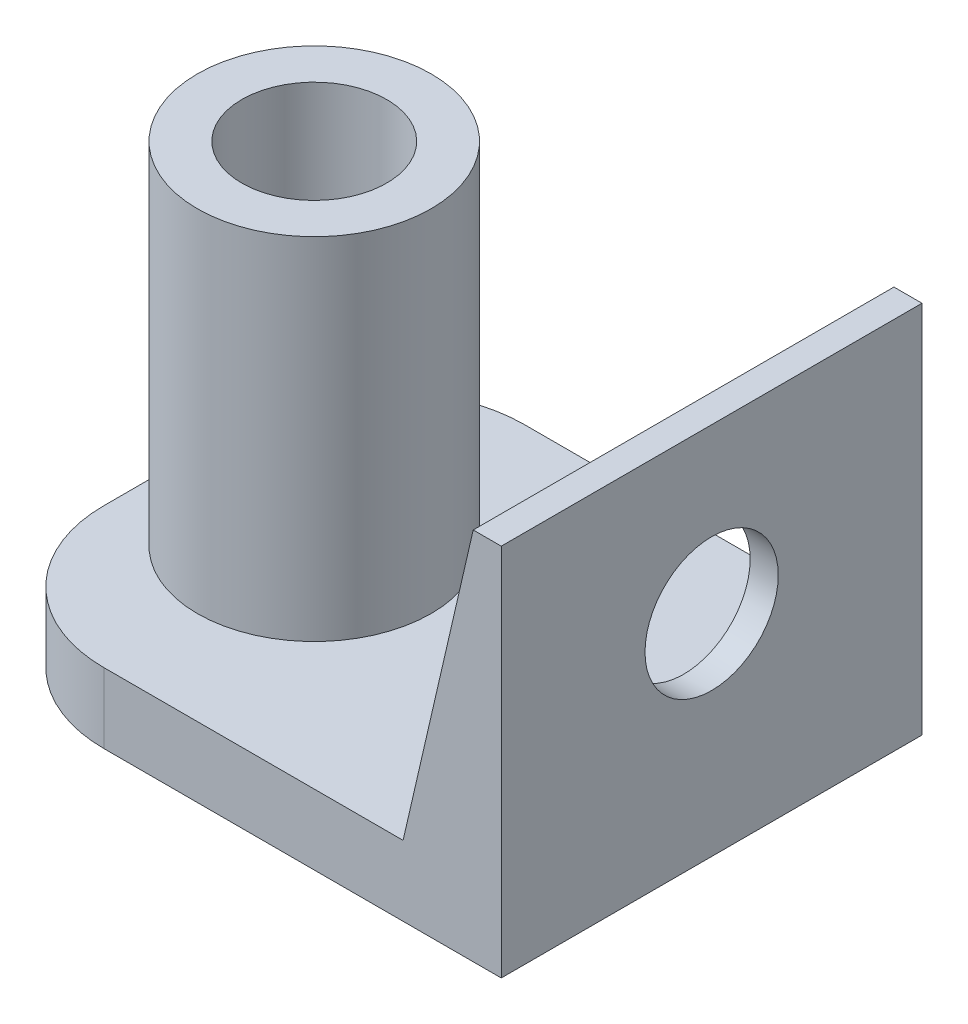
ISO-10303-21;
HEADER;
FILE_DESCRIPTION(('STEP AP214'),'2;1');
FILE_NAME('part.step','',(''),(''),'','','');
FILE_SCHEMA(('AUTOMOTIVE_DESIGN { 1 0 10303 214 1 1 1 1 }'));
ENDSEC;
DATA;
#1=APPLICATION_CONTEXT('core data for automotive mechanical design processes');
#2=APPLICATION_PROTOCOL_DEFINITION('international standard','automotive_design',2000,#1);
#3=PRODUCT_CONTEXT('',#1,'mechanical');
#4=PRODUCT('Part','Part','',(#3));
#5=PRODUCT_RELATED_PRODUCT_CATEGORY('part','',(#4));
#6=PRODUCT_DEFINITION_FORMATION('','',#4);
#7=PRODUCT_DEFINITION_CONTEXT('part definition',#1,'design');
#8=PRODUCT_DEFINITION('design','',#6,#7);
#9=PRODUCT_DEFINITION_SHAPE('','',#8);
#10=(LENGTH_UNIT() NAMED_UNIT(*) SI_UNIT(.MILLI.,.METRE.));
#11=(NAMED_UNIT(*) PLANE_ANGLE_UNIT() SI_UNIT($,.RADIAN.));
#12=(NAMED_UNIT(*) SI_UNIT($,.STERADIAN.) SOLID_ANGLE_UNIT());
#13=UNCERTAINTY_MEASURE_WITH_UNIT(LENGTH_MEASURE(1.E-05),#10,'distance_accuracy_value','');
#14=(GEOMETRIC_REPRESENTATION_CONTEXT(3) GLOBAL_UNCERTAINTY_ASSIGNED_CONTEXT((#13)) GLOBAL_UNIT_ASSIGNED_CONTEXT((#10,
#11,#12)) REPRESENTATION_CONTEXT('',''));
#15=CARTESIAN_POINT('',(0.,0.,0.));
#16=DIRECTION('',(0.,0.,1.));
#17=DIRECTION('',(1.,0.,0.));
#18=AXIS2_PLACEMENT_3D('',#15,#16,#17);
#19=CARTESIAN_POINT('',(21.8,3.,18.));
#20=DIRECTION('',(0.,-1.,0.));
#21=DIRECTION('',(1.,0.,0.));
#22=AXIS2_PLACEMENT_3D('',#19,#20,#21);
#23=PLANE('',#22);
#24=CARTESIAN_POINT('',(6.,3.,9.));
#25=DIRECTION('',(0.,-1.,0.));
#26=DIRECTION('',(1.,0.,0.));
#27=AXIS2_PLACEMENT_3D('',#24,#25,#26);
#28=CIRCLE('',#27,5.);
#29=CARTESIAN_POINT('',(11.,3.,9.));
#30=VERTEX_POINT('',#29);
#31=EDGE_CURVE('E41',#30,#30,#28,.F.);
#32=ORIENTED_EDGE('',*,*,#31,.F.);
#33=EDGE_LOOP('',(#32));
#34=FACE_BOUND('',#33,.T.);
#35=DIRECTION('',(-1.,0.,0.));
#36=VECTOR('',#35,1.);
#37=CARTESIAN_POINT('',(21.8,3.,0.));
#38=LINE('',#37,#36);
#39=CARTESIAN_POINT('',(18.8,3.,0.));
#40=VERTEX_POINT('',#39);
#41=CARTESIAN_POINT('',(6.,3.,0.));
#42=VERTEX_POINT('',#41);
#43=EDGE_CURVE('E227',#40,#42,#38,.T.);
#44=ORIENTED_EDGE('',*,*,#43,.T.);
#45=CARTESIAN_POINT('',(6.,3.,6.));
#46=DIRECTION('',(0.,-1.,0.));
#47=DIRECTION('',(1.,0.,0.));
#48=AXIS2_PLACEMENT_3D('',#45,#46,#47);
#49=CIRCLE('',#48,6.);
#50=CARTESIAN_POINT('',(0.,3.,6.));
#51=VERTEX_POINT('',#50);
#52=EDGE_CURVE('E176',#42,#51,#49,.F.);
#53=ORIENTED_EDGE('',*,*,#52,.T.);
#54=DIRECTION('',(0.,0.,-1.));
#55=VECTOR('',#54,1.);
#56=CARTESIAN_POINT('',(0.,3.,18.));
#57=LINE('',#56,#55);
#58=CARTESIAN_POINT('',(0.,3.,12.));
#59=VERTEX_POINT('',#58);
#60=EDGE_CURVE('E142',#59,#51,#57,.T.);
#61=ORIENTED_EDGE('',*,*,#60,.F.);
#62=CARTESIAN_POINT('',(6.,3.,12.));
#63=DIRECTION('',(0.,-1.,0.));
#64=DIRECTION('',(1.,0.,0.));
#65=AXIS2_PLACEMENT_3D('',#62,#63,#64);
#66=CIRCLE('',#65,6.);
#67=CARTESIAN_POINT('',(6.,3.,18.));
#68=VERTEX_POINT('',#67);
#69=EDGE_CURVE('E48',#59,#68,#66,.F.);
#70=ORIENTED_EDGE('',*,*,#69,.T.);
#71=DIRECTION('',(-1.,0.,0.));
#72=VECTOR('',#71,1.);
#73=CARTESIAN_POINT('',(21.8,3.,18.));
#74=LINE('',#73,#72);
#75=CARTESIAN_POINT('',(18.8,3.,18.));
#76=VERTEX_POINT('',#75);
#77=EDGE_CURVE('E147',#76,#68,#74,.T.);
#78=ORIENTED_EDGE('',*,*,#77,.F.);
#79=DIRECTION('',(0.,0.,1.));
#80=VECTOR('',#79,1.);
#81=CARTESIAN_POINT('',(18.8,3.,15.));
#82=LINE('',#81,#80);
#83=CARTESIAN_POINT('',(18.8,3.,15.));
#84=VERTEX_POINT('',#83);
#85=EDGE_CURVE('E135',#84,#76,#82,.T.);
#86=ORIENTED_EDGE('',*,*,#85,.F.);
#87=DIRECTION('',(1.,0.,0.));
#88=VECTOR('',#87,1.);
#89=CARTESIAN_POINT('',(18.8,3.,15.));
#90=LINE('',#89,#88);
#91=CARTESIAN_POINT('',(21.8,3.,15.));
#92=VERTEX_POINT('',#91);
#93=EDGE_CURVE('E123',#84,#92,#90,.T.);
#94=ORIENTED_EDGE('',*,*,#93,.T.);
#95=DIRECTION('',(0.,0.,-1.));
#96=VECTOR('',#95,1.);
#97=CARTESIAN_POINT('',(21.8,3.,18.));
#98=LINE('',#97,#96);
#99=CARTESIAN_POINT('',(21.8,3.,3.));
#100=VERTEX_POINT('',#99);
#101=EDGE_CURVE('E133',#92,#100,#98,.T.);
#102=ORIENTED_EDGE('',*,*,#101,.T.);
#103=DIRECTION('',(1.,0.,0.));
#104=VECTOR('',#103,1.);
#105=CARTESIAN_POINT('',(18.8,3.,3.));
#106=LINE('',#105,#104);
#107=CARTESIAN_POINT('',(18.8,3.,3.));
#108=VERTEX_POINT('',#107);
#109=EDGE_CURVE('E269',#108,#100,#106,.T.);
#110=ORIENTED_EDGE('',*,*,#109,.F.);
#111=DIRECTION('',(0.,0.,-1.));
#112=VECTOR('',#111,1.);
#113=CARTESIAN_POINT('',(18.8,3.,3.));
#114=LINE('',#113,#112);
#115=EDGE_CURVE('E267',#108,#40,#114,.T.);
#116=ORIENTED_EDGE('',*,*,#115,.T.);
#117=EDGE_LOOP('',(#44,#53,#61,#70,#78,#86,#94,#102,#110,#116));
#118=FACE_BOUND('',#117,.T.);
#119=ADVANCED_FACE('F33',(#34,#118),#23,.F.);
#120=CARTESIAN_POINT('',(21.8,16.,18.));
#121=DIRECTION('',(1.,0.,0.));
#122=DIRECTION('',(0.,0.,-1.));
#123=AXIS2_PLACEMENT_3D('',#120,#121,#122);
#124=PLANE('',#123);
#125=CARTESIAN_POINT('',(21.8,9.,9.));
#126=DIRECTION('',(1.,0.,0.));
#127=DIRECTION('',(0.,0.,-1.));
#128=AXIS2_PLACEMENT_3D('',#125,#126,#127);
#129=CIRCLE('',#128,2.85);
#130=CARTESIAN_POINT('',(21.8,9.,6.15));
#131=VERTEX_POINT('',#130);
#132=EDGE_CURVE('E161',#131,#131,#129,.T.);
#133=ORIENTED_EDGE('',*,*,#132,.T.);
#134=EDGE_LOOP('',(#133));
#135=FACE_BOUND('',#134,.T.);
#136=DIRECTION('',(0.,0.,-1.));
#137=VECTOR('',#136,1.);
#138=CARTESIAN_POINT('',(21.8,16.,18.));
#139=LINE('',#138,#137);
#140=CARTESIAN_POINT('',(21.8,16.,15.));
#141=VERTEX_POINT('',#140);
#142=CARTESIAN_POINT('',(21.8,16.,3.));
#143=VERTEX_POINT('',#142);
#144=EDGE_CURVE('E141',#141,#143,#139,.T.);
#145=ORIENTED_EDGE('',*,*,#144,.T.);
#146=DIRECTION('',(0.,1.,0.));
#147=VECTOR('',#146,1.);
#148=CARTESIAN_POINT('',(21.8,3.,3.));
#149=LINE('',#148,#147);
#150=EDGE_CURVE('E140',#100,#143,#149,.T.);
#151=ORIENTED_EDGE('',*,*,#150,.F.);
#152=ORIENTED_EDGE('',*,*,#101,.F.);
#153=DIRECTION('',(0.,1.,0.));
#154=VECTOR('',#153,1.);
#155=CARTESIAN_POINT('',(21.8,3.,15.));
#156=LINE('',#155,#154);
#157=EDGE_CURVE('E120',#92,#141,#156,.T.);
#158=ORIENTED_EDGE('',*,*,#157,.T.);
#159=EDGE_LOOP('',(#145,#151,#152,#158));
#160=FACE_BOUND('',#159,.T.);
#161=ADVANCED_FACE('F138',(#135,#160),#124,.F.);
#162=CARTESIAN_POINT('',(0.,3.,18.));
#163=DIRECTION('',(1.,0.,0.));
#164=DIRECTION('',(0.,1.,0.));
#165=AXIS2_PLACEMENT_3D('',#162,#163,#164);
#166=PLANE('',#165);
#167=ORIENTED_EDGE('',*,*,#60,.T.);
#168=DIRECTION('',(0.,-1.,0.));
#169=VECTOR('',#168,1.);
#170=CARTESIAN_POINT('',(0.,3.,6.));
#171=LINE('',#170,#169);
#172=CARTESIAN_POINT('',(0.,0.,6.));
#173=VERTEX_POINT('',#172);
#174=EDGE_CURVE('E167',#51,#173,#171,.T.);
#175=ORIENTED_EDGE('',*,*,#174,.T.);
#176=DIRECTION('',(0.,0.,-1.));
#177=VECTOR('',#176,1.);
#178=CARTESIAN_POINT('',(0.,0.,18.));
#179=LINE('',#178,#177);
#180=CARTESIAN_POINT('',(0.,0.,12.));
#181=VERTEX_POINT('',#180);
#182=EDGE_CURVE('E157',#181,#173,#179,.T.);
#183=ORIENTED_EDGE('',*,*,#182,.F.);
#184=DIRECTION('',(0.,-1.,0.));
#185=VECTOR('',#184,1.);
#186=CARTESIAN_POINT('',(0.,3.,12.));
#187=LINE('',#186,#185);
#188=EDGE_CURVE('E160',#181,#59,#187,.F.);
#189=ORIENTED_EDGE('',*,*,#188,.T.);
#190=EDGE_LOOP('',(#167,#175,#183,#189));
#191=FACE_BOUND('',#190,.T.);
#192=ADVANCED_FACE('F190',(#191),#166,.F.);
#193=CARTESIAN_POINT('',(0.,0.,18.));
#194=DIRECTION('',(0.,1.,0.));
#195=DIRECTION('',(0.,0.,1.));
#196=AXIS2_PLACEMENT_3D('',#193,#194,#195);
#197=PLANE('',#196);
#198=CARTESIAN_POINT('',(6.,0.,9.));
#199=DIRECTION('',(0.,1.,0.));
#200=DIRECTION('',(0.,0.,1.));
#201=AXIS2_PLACEMENT_3D('',#198,#199,#200);
#202=CIRCLE('',#201,2.7);
#203=CARTESIAN_POINT('',(6.,0.,11.7));
#204=VERTEX_POINT('',#203);
#205=EDGE_CURVE('E165',#204,#204,#202,.T.);
#206=ORIENTED_EDGE('',*,*,#205,.T.);
#207=EDGE_LOOP('',(#206));
#208=FACE_BOUND('',#207,.T.);
#209=ORIENTED_EDGE('',*,*,#182,.T.);
#210=CARTESIAN_POINT('',(6.,0.,6.));
#211=DIRECTION('',(0.,1.,0.));
#212=DIRECTION('',(0.,0.,1.));
#213=AXIS2_PLACEMENT_3D('',#210,#211,#212);
#214=CIRCLE('',#213,6.);
#215=CARTESIAN_POINT('',(6.,0.,0.));
#216=VERTEX_POINT('',#215);
#217=EDGE_CURVE('E172',#173,#216,#214,.F.);
#218=ORIENTED_EDGE('',*,*,#217,.T.);
#219=DIRECTION('',(1.,0.,0.));
#220=VECTOR('',#219,1.);
#221=CARTESIAN_POINT('',(0.,0.,0.));
#222=LINE('',#221,#220);
#223=CARTESIAN_POINT('',(23.,0.,0.));
#224=VERTEX_POINT('',#223);
#225=EDGE_CURVE('E249',#216,#224,#222,.T.);
#226=ORIENTED_EDGE('',*,*,#225,.T.);
#227=DIRECTION('',(0.,0.,-1.));
#228=VECTOR('',#227,1.);
#229=CARTESIAN_POINT('',(23.,0.,18.));
#230=LINE('',#229,#228);
#231=CARTESIAN_POINT('',(23.,0.,18.));
#232=VERTEX_POINT('',#231);
#233=EDGE_CURVE('E154',#232,#224,#230,.T.);
#234=ORIENTED_EDGE('',*,*,#233,.F.);
#235=DIRECTION('',(1.,0.,0.));
#236=VECTOR('',#235,1.);
#237=CARTESIAN_POINT('',(0.,0.,18.));
#238=LINE('',#237,#236);
#239=CARTESIAN_POINT('',(6.,0.,18.));
#240=VERTEX_POINT('',#239);
#241=EDGE_CURVE('E233',#240,#232,#238,.T.);
#242=ORIENTED_EDGE('',*,*,#241,.F.);
#243=CARTESIAN_POINT('',(6.,0.,12.));
#244=DIRECTION('',(0.,1.,0.));
#245=DIRECTION('',(0.,0.,1.));
#246=AXIS2_PLACEMENT_3D('',#243,#244,#245);
#247=CIRCLE('',#246,6.);
#248=EDGE_CURVE('E170',#240,#181,#247,.F.);
#249=ORIENTED_EDGE('',*,*,#248,.T.);
#250=EDGE_LOOP('',(#209,#218,#226,#234,#242,#249));
#251=FACE_BOUND('',#250,.T.);
#252=ADVANCED_FACE('F205',(#208,#251),#197,.F.);
#253=CARTESIAN_POINT('',(23.,0.,18.));
#254=DIRECTION('',(-1.,0.,0.));
#255=DIRECTION('',(0.,0.,1.));
#256=AXIS2_PLACEMENT_3D('',#253,#254,#255);
#257=PLANE('',#256);
#258=CARTESIAN_POINT('',(23.,9.,9.));
#259=DIRECTION('',(-1.,0.,0.));
#260=DIRECTION('',(0.,0.,1.));
#261=AXIS2_PLACEMENT_3D('',#258,#259,#260);
#262=CIRCLE('',#261,2.85);
#263=CARTESIAN_POINT('',(23.,9.,11.85));
#264=VERTEX_POINT('',#263);
#265=EDGE_CURVE('E164',#264,#264,#262,.T.);
#266=ORIENTED_EDGE('',*,*,#265,.T.);
#267=EDGE_LOOP('',(#266));
#268=FACE_BOUND('',#267,.T.);
#269=DIRECTION('',(0.,1.,0.));
#270=VECTOR('',#269,1.);
#271=CARTESIAN_POINT('',(23.,0.,0.));
#272=LINE('',#271,#270);
#273=CARTESIAN_POINT('',(23.,16.,0.));
#274=VERTEX_POINT('',#273);
#275=EDGE_CURVE('E251',#224,#274,#272,.T.);
#276=ORIENTED_EDGE('',*,*,#275,.T.);
#277=DIRECTION('',(0.,0.,-1.));
#278=VECTOR('',#277,1.);
#279=CARTESIAN_POINT('',(23.,16.,18.));
#280=LINE('',#279,#278);
#281=CARTESIAN_POINT('',(23.,16.,18.));
#282=VERTEX_POINT('',#281);
#283=EDGE_CURVE('E151',#282,#274,#280,.T.);
#284=ORIENTED_EDGE('',*,*,#283,.F.);
#285=DIRECTION('',(0.,1.,0.));
#286=VECTOR('',#285,1.);
#287=CARTESIAN_POINT('',(23.,0.,18.));
#288=LINE('',#287,#286);
#289=EDGE_CURVE('E238',#232,#282,#288,.T.);
#290=ORIENTED_EDGE('',*,*,#289,.F.);
#291=ORIENTED_EDGE('',*,*,#233,.T.);
#292=EDGE_LOOP('',(#276,#284,#290,#291));
#293=FACE_BOUND('',#292,.T.);
#294=ADVANCED_FACE('F201',(#268,#293),#257,.F.);
#295=CARTESIAN_POINT('',(23.,16.,18.));
#296=DIRECTION('',(0.,-1.,0.));
#297=DIRECTION('',(0.,0.,-1.));
#298=AXIS2_PLACEMENT_3D('',#295,#296,#297);
#299=PLANE('',#298);
#300=DIRECTION('',(-1.,0.,0.));
#301=VECTOR('',#300,1.);
#302=CARTESIAN_POINT('',(23.,16.,0.));
#303=LINE('',#302,#301);
#304=CARTESIAN_POINT('',(21.8,16.,0.));
#305=VERTEX_POINT('',#304);
#306=EDGE_CURVE('E242',#274,#305,#303,.T.);
#307=ORIENTED_EDGE('',*,*,#306,.T.);
#308=DIRECTION('',(0.,0.,-1.));
#309=VECTOR('',#308,1.);
#310=CARTESIAN_POINT('',(21.8,16.,3.));
#311=LINE('',#310,#309);
#312=EDGE_CURVE('E255',#143,#305,#311,.T.);
#313=ORIENTED_EDGE('',*,*,#312,.F.);
#314=ORIENTED_EDGE('',*,*,#144,.F.);
#315=CARTESIAN_POINT('',(21.8,16.,18.));
#316=VERTEX_POINT('',#315);
#317=EDGE_CURVE('E144',#316,#141,#139,.T.);
#318=ORIENTED_EDGE('',*,*,#317,.F.);
#319=DIRECTION('',(-1.,0.,0.));
#320=VECTOR('',#319,1.);
#321=CARTESIAN_POINT('',(23.,16.,18.));
#322=LINE('',#321,#320);
#323=EDGE_CURVE('E240',#282,#316,#322,.T.);
#324=ORIENTED_EDGE('',*,*,#323,.F.);
#325=ORIENTED_EDGE('',*,*,#283,.T.);
#326=EDGE_LOOP('',(#307,#313,#314,#318,#324,#325));
#327=FACE_BOUND('',#326,.T.);
#328=ADVANCED_FACE('F197',(#327),#299,.F.);
#329=CARTESIAN_POINT('',(0.,0.,18.));
#330=DIRECTION('',(0.,0.,1.));
#331=DIRECTION('',(1.,0.,0.));
#332=AXIS2_PLACEMENT_3D('',#329,#330,#331);
#333=PLANE('',#332);
#334=ORIENTED_EDGE('',*,*,#77,.T.);
#335=DIRECTION('',(0.,-1.,0.));
#336=VECTOR('',#335,1.);
#337=CARTESIAN_POINT('',(6.,0.,18.));
#338=LINE('',#337,#336);
#339=EDGE_CURVE('E178',#68,#240,#338,.T.);
#340=ORIENTED_EDGE('',*,*,#339,.T.);
#341=ORIENTED_EDGE('',*,*,#241,.T.);
#342=ORIENTED_EDGE('',*,*,#289,.T.);
#343=ORIENTED_EDGE('',*,*,#323,.T.);
#344=DIRECTION('',(-0.224859506698758,-0.97439119569462,0.));
#345=VECTOR('',#344,1.);
#346=CARTESIAN_POINT('',(21.8,16.,18.));
#347=LINE('',#346,#345);
#348=EDGE_CURVE('E136',#316,#76,#347,.T.);
#349=ORIENTED_EDGE('',*,*,#348,.T.);
#350=EDGE_LOOP('',(#334,#340,#341,#342,#343,#349));
#351=FACE_BOUND('',#350,.T.);
#352=ADVANCED_FACE('F200',(#351),#333,.T.);
#353=CARTESIAN_POINT('',(0.,0.,0.));
#354=DIRECTION('',(0.,0.,1.));
#355=DIRECTION('',(1.,0.,0.));
#356=AXIS2_PLACEMENT_3D('',#353,#354,#355);
#357=PLANE('',#356);
#358=ORIENTED_EDGE('',*,*,#225,.F.);
#359=DIRECTION('',(0.,-1.,0.));
#360=VECTOR('',#359,1.);
#361=CARTESIAN_POINT('',(6.,0.,0.));
#362=LINE('',#361,#360);
#363=EDGE_CURVE('E56',#216,#42,#362,.F.);
#364=ORIENTED_EDGE('',*,*,#363,.T.);
#365=ORIENTED_EDGE('',*,*,#43,.F.);
#366=DIRECTION('',(-0.224859506698758,-0.97439119569462,0.));
#367=VECTOR('',#366,1.);
#368=CARTESIAN_POINT('',(21.8,16.,0.));
#369=LINE('',#368,#367);
#370=EDGE_CURVE('E264',#305,#40,#369,.T.);
#371=ORIENTED_EDGE('',*,*,#370,.F.);
#372=ORIENTED_EDGE('',*,*,#306,.F.);
#373=ORIENTED_EDGE('',*,*,#275,.F.);
#374=EDGE_LOOP('',(#358,#364,#365,#371,#372,#373));
#375=FACE_BOUND('',#374,.T.);
#376=ADVANCED_FACE('F194',(#375),#357,.F.);
#377=CARTESIAN_POINT('',(0.,9.,9.));
#378=DIRECTION('',(1.,0.,0.));
#379=DIRECTION('',(0.,0.,-1.));
#380=AXIS2_PLACEMENT_3D('',#377,#378,#379);
#381=CYLINDRICAL_SURFACE('',#380,2.85);
#382=ORIENTED_EDGE('',*,*,#132,.F.);
#383=EDGE_LOOP('',(#382));
#384=FACE_BOUND('',#383,.T.);
#385=ORIENTED_EDGE('',*,*,#265,.F.);
#386=EDGE_LOOP('',(#385));
#387=FACE_BOUND('',#386,.T.);
#388=ADVANCED_FACE('F289',(#384,#387),#381,.F.);
#389=CARTESIAN_POINT('',(6.,16.,9.));
#390=DIRECTION('',(0.,-1.,0.));
#391=DIRECTION('',(0.,0.,-1.));
#392=AXIS2_PLACEMENT_3D('',#389,#390,#391);
#393=CYLINDRICAL_SURFACE('',#392,2.7);
#394=ORIENTED_EDGE('',*,*,#205,.F.);
#395=EDGE_LOOP('',(#394));
#396=FACE_BOUND('',#395,.T.);
#397=CARTESIAN_POINT('',(6.,10.,9.));
#398=DIRECTION('',(0.,1.,0.));
#399=DIRECTION('',(-1.,0.,0.));
#400=AXIS2_PLACEMENT_3D('',#397,#398,#399);
#401=CIRCLE('',#400,2.7);
#402=CARTESIAN_POINT('',(3.3,10.,9.));
#403=VERTEX_POINT('',#402);
#404=EDGE_CURVE('E293',#403,#403,#401,.T.);
#405=ORIENTED_EDGE('',*,*,#404,.T.);
#406=EDGE_LOOP('',(#405));
#407=FACE_BOUND('',#406,.T.);
#408=ADVANCED_FACE('F285',(#396,#407),#393,.F.);
#409=CARTESIAN_POINT('',(21.8,16.,15.));
#410=DIRECTION('',(-0.97439119569462,0.224859506698758,0.));
#411=DIRECTION('',(-0.224859506698758,-0.97439119569462,0.));
#412=AXIS2_PLACEMENT_3D('',#409,#410,#411);
#413=PLANE('',#412);
#414=ORIENTED_EDGE('',*,*,#348,.F.);
#415=ORIENTED_EDGE('',*,*,#317,.T.);
#416=DIRECTION('',(-0.224859506698758,-0.97439119569462,0.));
#417=VECTOR('',#416,1.);
#418=CARTESIAN_POINT('',(21.8,16.,15.));
#419=LINE('',#418,#417);
#420=EDGE_CURVE('E125',#141,#84,#419,.T.);
#421=ORIENTED_EDGE('',*,*,#420,.T.);
#422=ORIENTED_EDGE('',*,*,#85,.T.);
#423=EDGE_LOOP('',(#414,#415,#421,#422));
#424=FACE_BOUND('',#423,.T.);
#425=ADVANCED_FACE('F288',(#424),#413,.T.);
#426=CARTESIAN_POINT('',(0.,0.,15.));
#427=DIRECTION('',(0.,0.,1.));
#428=DIRECTION('',(1.,0.,0.));
#429=AXIS2_PLACEMENT_3D('',#426,#427,#428);
#430=PLANE('',#429);
#431=ORIENTED_EDGE('',*,*,#93,.F.);
#432=ORIENTED_EDGE('',*,*,#420,.F.);
#433=ORIENTED_EDGE('',*,*,#157,.F.);
#434=EDGE_LOOP('',(#431,#432,#433));
#435=FACE_BOUND('',#434,.T.);
#436=ADVANCED_FACE('F122',(#435),#430,.F.);
#437=CARTESIAN_POINT('',(21.8,16.,3.));
#438=DIRECTION('',(0.97439119569462,-0.224859506698758,0.));
#439=DIRECTION('',(0.224859506698758,0.97439119569462,0.));
#440=AXIS2_PLACEMENT_3D('',#437,#438,#439);
#441=PLANE('',#440);
#442=ORIENTED_EDGE('',*,*,#370,.T.);
#443=ORIENTED_EDGE('',*,*,#115,.F.);
#444=DIRECTION('',(-0.224859506698758,-0.97439119569462,0.));
#445=VECTOR('',#444,1.);
#446=CARTESIAN_POINT('',(21.8,16.,3.));
#447=LINE('',#446,#445);
#448=EDGE_CURVE('E266',#143,#108,#447,.T.);
#449=ORIENTED_EDGE('',*,*,#448,.F.);
#450=ORIENTED_EDGE('',*,*,#312,.T.);
#451=EDGE_LOOP('',(#442,#443,#449,#450));
#452=FACE_BOUND('',#451,.T.);
#453=ADVANCED_FACE('F222',(#452),#441,.F.);
#454=CARTESIAN_POINT('',(0.,0.,3.));
#455=DIRECTION('',(0.,0.,1.));
#456=DIRECTION('',(1.,0.,0.));
#457=AXIS2_PLACEMENT_3D('',#454,#455,#456);
#458=PLANE('',#457);
#459=ORIENTED_EDGE('',*,*,#109,.T.);
#460=ORIENTED_EDGE('',*,*,#150,.T.);
#461=ORIENTED_EDGE('',*,*,#448,.T.);
#462=EDGE_LOOP('',(#459,#460,#461));
#463=FACE_BOUND('',#462,.T.);
#464=ADVANCED_FACE('F214',(#463),#458,.T.);
#465=CARTESIAN_POINT('',(6.,3.,6.));
#466=DIRECTION('',(0.,-1.,0.));
#467=DIRECTION('',(1.,0.,0.));
#468=AXIS2_PLACEMENT_3D('',#465,#466,#467);
#469=CYLINDRICAL_SURFACE('',#468,6.);
#470=ORIENTED_EDGE('',*,*,#52,.F.);
#471=ORIENTED_EDGE('',*,*,#363,.F.);
#472=ORIENTED_EDGE('',*,*,#217,.F.);
#473=ORIENTED_EDGE('',*,*,#174,.F.);
#474=EDGE_LOOP('',(#470,#471,#472,#473));
#475=FACE_BOUND('',#474,.T.);
#476=ADVANCED_FACE('F212',(#475),#469,.T.);
#477=CARTESIAN_POINT('',(6.,0.,12.));
#478=DIRECTION('',(0.,1.,0.));
#479=DIRECTION('',(-1.,0.,0.));
#480=AXIS2_PLACEMENT_3D('',#477,#478,#479);
#481=CYLINDRICAL_SURFACE('',#480,6.);
#482=ORIENTED_EDGE('',*,*,#69,.F.);
#483=ORIENTED_EDGE('',*,*,#188,.F.);
#484=ORIENTED_EDGE('',*,*,#248,.F.);
#485=ORIENTED_EDGE('',*,*,#339,.F.);
#486=EDGE_LOOP('',(#482,#483,#484,#485));
#487=FACE_BOUND('',#486,.T.);
#488=ADVANCED_FACE('F35',(#487),#481,.T.);
#489=CARTESIAN_POINT('',(6.,18.,9.));
#490=DIRECTION('',(0.,1.,0.));
#491=DIRECTION('',(-1.,0.,0.));
#492=AXIS2_PLACEMENT_3D('',#489,#490,#491);
#493=PLANE('',#492);
#494=CARTESIAN_POINT('',(6.,18.,9.));
#495=DIRECTION('',(0.,1.,0.));
#496=DIRECTION('',(-1.,0.,0.));
#497=AXIS2_PLACEMENT_3D('',#494,#495,#496);
#498=CIRCLE('',#497,5.);
#499=CARTESIAN_POINT('',(0.999999999999996,18.,9.));
#500=VERTEX_POINT('',#499);
#501=EDGE_CURVE('E270',#500,#500,#498,.T.);
#502=ORIENTED_EDGE('',*,*,#501,.T.);
#503=EDGE_LOOP('',(#502));
#504=FACE_BOUND('',#503,.T.);
#505=CARTESIAN_POINT('',(6.,18.,9.));
#506=DIRECTION('',(0.,1.,0.));
#507=DIRECTION('',(-1.,0.,0.));
#508=AXIS2_PLACEMENT_3D('',#505,#506,#507);
#509=CIRCLE('',#508,3.1);
#510=CARTESIAN_POINT('',(2.9,18.,9.));
#511=VERTEX_POINT('',#510);
#512=EDGE_CURVE('E274',#511,#511,#509,.T.);
#513=ORIENTED_EDGE('',*,*,#512,.F.);
#514=EDGE_LOOP('',(#513));
#515=FACE_BOUND('',#514,.T.);
#516=ADVANCED_FACE('F220',(#504,#515),#493,.T.);
#517=CARTESIAN_POINT('',(6.,18.,9.));
#518=DIRECTION('',(0.,-1.,0.));
#519=DIRECTION('',(1.,0.,0.));
#520=AXIS2_PLACEMENT_3D('',#517,#518,#519);
#521=CYLINDRICAL_SURFACE('',#520,5.);
#522=ORIENTED_EDGE('',*,*,#501,.F.);
#523=EDGE_LOOP('',(#522));
#524=FACE_BOUND('',#523,.T.);
#525=ORIENTED_EDGE('',*,*,#31,.T.);
#526=EDGE_LOOP('',(#525));
#527=FACE_BOUND('',#526,.T.);
#528=ADVANCED_FACE('F183',(#524,#527),#521,.T.);
#529=CARTESIAN_POINT('',(6.,18.,9.));
#530=DIRECTION('',(0.,-1.,0.));
#531=DIRECTION('',(1.,0.,0.));
#532=AXIS2_PLACEMENT_3D('',#529,#530,#531);
#533=CYLINDRICAL_SURFACE('',#532,3.1);
#534=CARTESIAN_POINT('',(6.,10.,9.));
#535=DIRECTION('',(0.,1.,0.));
#536=DIRECTION('',(-1.,0.,0.));
#537=AXIS2_PLACEMENT_3D('',#534,#535,#536);
#538=CIRCLE('',#537,3.1);
#539=CARTESIAN_POINT('',(2.9,10.,9.));
#540=VERTEX_POINT('',#539);
#541=EDGE_CURVE('E11',#540,#540,#538,.T.);
#542=ORIENTED_EDGE('',*,*,#541,.F.);
#543=EDGE_LOOP('',(#542));
#544=FACE_BOUND('',#543,.T.);
#545=ORIENTED_EDGE('',*,*,#512,.T.);
#546=EDGE_LOOP('',(#545));
#547=FACE_BOUND('',#546,.T.);
#548=ADVANCED_FACE('F300',(#544,#547),#533,.F.);
#549=CARTESIAN_POINT('',(6.,10.,9.));
#550=DIRECTION('',(0.,1.,0.));
#551=DIRECTION('',(-1.,0.,0.));
#552=AXIS2_PLACEMENT_3D('',#549,#550,#551);
#553=PLANE('',#552);
#554=ORIENTED_EDGE('',*,*,#541,.T.);
#555=EDGE_LOOP('',(#554));
#556=FACE_BOUND('',#555,.T.);
#557=ORIENTED_EDGE('',*,*,#404,.F.);
#558=EDGE_LOOP('',(#557));
#559=FACE_BOUND('',#558,.T.);
#560=ADVANCED_FACE('F414',(#556,#559),#553,.T.);
#561=CLOSED_SHELL('',(#119,#161,#192,#252,#294,#328,#352,#376,#388,#408,#425,#436,#453,#464,
#476,#488,#516,#528,#548,#560));
#562=MANIFOLD_SOLID_BREP('B2',#561);
#563=ADVANCED_BREP_SHAPE_REPRESENTATION('',(#18,#562),#14);
#564=SHAPE_DEFINITION_REPRESENTATION(#9,#563);
ENDSEC;
END-ISO-10303-21;
